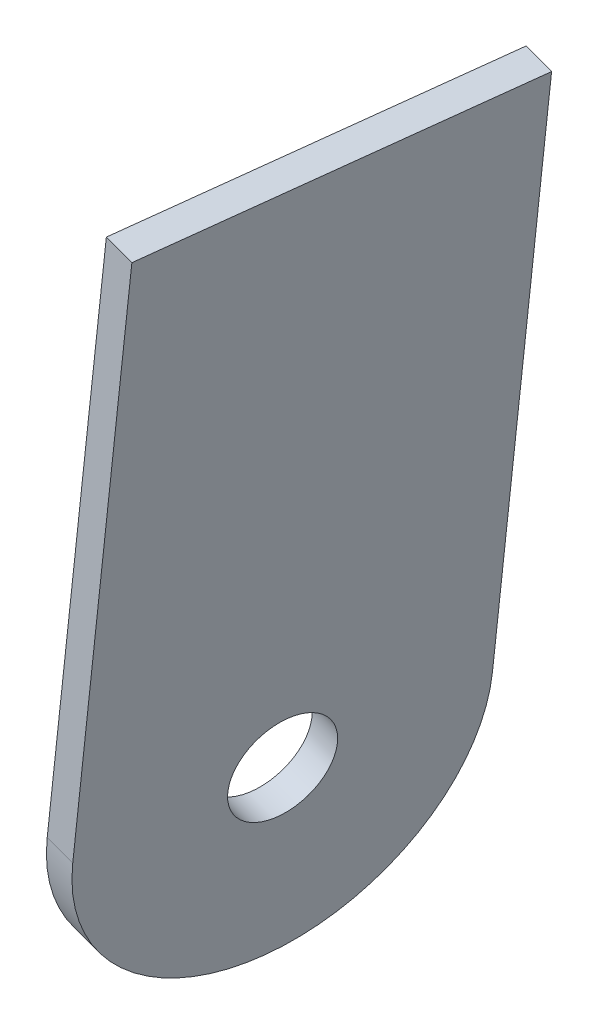
ISO-10303-21;
HEADER;
FILE_DESCRIPTION(('STEP AP214'),'2;1');
FILE_NAME('part.step','',(''),(''),'','','');
FILE_SCHEMA(('AUTOMOTIVE_DESIGN { 1 0 10303 214 1 1 1 1 }'));
ENDSEC;
DATA;
#1=APPLICATION_CONTEXT('core data for automotive mechanical design processes');
#2=APPLICATION_PROTOCOL_DEFINITION('international standard','automotive_design',2000,#1);
#3=PRODUCT_CONTEXT('',#1,'mechanical');
#4=PRODUCT('Part','Part','',(#3));
#5=PRODUCT_RELATED_PRODUCT_CATEGORY('part','',(#4));
#6=PRODUCT_DEFINITION_FORMATION('','',#4);
#7=PRODUCT_DEFINITION_CONTEXT('part definition',#1,'design');
#8=PRODUCT_DEFINITION('design','',#6,#7);
#9=PRODUCT_DEFINITION_SHAPE('','',#8);
#10=(LENGTH_UNIT() NAMED_UNIT(*) SI_UNIT(.MILLI.,.METRE.));
#11=(NAMED_UNIT(*) PLANE_ANGLE_UNIT() SI_UNIT($,.RADIAN.));
#12=(NAMED_UNIT(*) SI_UNIT($,.STERADIAN.) SOLID_ANGLE_UNIT());
#13=UNCERTAINTY_MEASURE_WITH_UNIT(LENGTH_MEASURE(1.E-05),#10,'distance_accuracy_value','');
#14=(GEOMETRIC_REPRESENTATION_CONTEXT(3) GLOBAL_UNCERTAINTY_ASSIGNED_CONTEXT((#13)) GLOBAL_UNIT_ASSIGNED_CONTEXT((#10,
#11,#12)) REPRESENTATION_CONTEXT('',''));
#15=CARTESIAN_POINT('',(0.,0.,0.));
#16=DIRECTION('',(0.,0.,1.));
#17=DIRECTION('',(1.,0.,0.));
#18=AXIS2_PLACEMENT_3D('',#15,#16,#17);
#19=CARTESIAN_POINT('',(-286.846376551254,325.682863199713,-591.634431416079));
#20=DIRECTION('',(-0.976357147680202,0.160922555502941,-0.144328276176855));
#21=DIRECTION('',(-0.162625264388925,-0.986687905764752,0.));
#22=AXIS2_PLACEMENT_3D('',#19,#20,#21);
#23=PLANE('',#22);
#24=DIRECTION('',(0.151111697234675,0.0306780966687194,-0.98804054033407));
#25=VECTOR('',#24,1.);
#26=CARTESIAN_POINT('',(-283.574412970837,355.458873629266,-580.569193857509));
#27=LINE('',#26,#25);
#28=CARTESIAN_POINT('',(-283.574412970837,355.458873629266,-580.569193857509));
#29=VERTEX_POINT('',#28);
#30=CARTESIAN_POINT('',(-280.695735138516,356.043291370805,-599.391366150874));
#31=VERTEX_POINT('',#30);
#32=EDGE_CURVE('E91',#29,#31,#27,.T.);
#33=ORIENTED_EDGE('',*,*,#32,.T.);
#34=DIRECTION('',(-0.154570291882481,-0.986490134525018,-0.0542700594451213));
#35=VECTOR('',#34,1.);
#36=CARTESIAN_POINT('',(-280.695735138516,356.043291370805,-599.391366150874));
#37=LINE('',#36,#35);
#38=CARTESIAN_POINT('',(-285.407037635094,325.975072070483,-601.045517562761));
#39=VERTEX_POINT('',#38);
#40=EDGE_CURVE('E86',#31,#39,#37,.T.);
#41=ORIENTED_EDGE('',*,*,#40,.T.);
#42=CARTESIAN_POINT('',(-286.846376551254,325.682863199713,-591.634431416079));
#43=DIRECTION('',(-0.976357147680202,0.160922555502941,-0.144328276176855));
#44=DIRECTION('',(-0.162625264388925,-0.986687905764752,0.));
#45=AXIS2_PLACEMENT_3D('',#42,#43,#44);
#46=CIRCLE('',#45,9.52500000000011);
#47=CARTESIAN_POINT('',(-288.285715467415,325.390654328943,-582.223345269396));
#48=VERTEX_POINT('',#47);
#49=EDGE_CURVE('E89',#39,#48,#46,.T.);
#50=ORIENTED_EDGE('',*,*,#49,.T.);
#51=DIRECTION('',(0.154570291882482,0.986490134525018,0.0542700594451214));
#52=VECTOR('',#51,1.);
#53=CARTESIAN_POINT('',(-288.285715467415,325.390654328943,-582.223345269397));
#54=LINE('',#53,#52);
#55=EDGE_CURVE('E56',#48,#29,#54,.T.);
#56=ORIENTED_EDGE('',*,*,#55,.T.);
#57=EDGE_LOOP('',(#33,#41,#50,#56));
#58=FACE_BOUND('',#57,.T.);
#59=CARTESIAN_POINT('',(-286.846376551254,325.682863199713,-591.634431416079));
#60=DIRECTION('',(-0.976357147680202,0.160922555502941,-0.144328276176855));
#61=DIRECTION('',(-0.162625264388925,-0.986687905764752,0.));
#62=AXIS2_PLACEMENT_3D('',#59,#60,#61);
#63=CIRCLE('',#62,2.48919999999999);
#64=CARTESIAN_POINT('',(-287.251183359371,323.226799664683,-591.634431416079));
#65=VERTEX_POINT('',#64);
#66=EDGE_CURVE('E106',#65,#65,#63,.T.);
#67=ORIENTED_EDGE('',*,*,#66,.F.);
#68=EDGE_LOOP('',(#67));
#69=FACE_BOUND('',#68,.T.);
#70=ADVANCED_FACE('F39',(#58,#69),#23,.T.);
#71=CARTESIAN_POINT('',(-285.296409579312,325.427398642852,-591.405310277648));
#72=DIRECTION('',(-0.976357147680202,0.160922555502941,-0.144328276176855));
#73=DIRECTION('',(-0.162625264388925,-0.986687905764752,0.));
#74=AXIS2_PLACEMENT_3D('',#71,#72,#73);
#75=PLANE('',#74);
#76=DIRECTION('',(0.151111697234675,0.0306780966687194,-0.98804054033407));
#77=VECTOR('',#76,1.);
#78=CARTESIAN_POINT('',(-282.024445998894,355.203409072405,-580.340072719079));
#79=LINE('',#78,#77);
#80=CARTESIAN_POINT('',(-282.024445998894,355.203409072405,-580.340072719079));
#81=VERTEX_POINT('',#80);
#82=CARTESIAN_POINT('',(-279.145768166574,355.787826813944,-599.162245012443));
#83=VERTEX_POINT('',#82);
#84=EDGE_CURVE('E103',#81,#83,#79,.T.);
#85=ORIENTED_EDGE('',*,*,#84,.F.);
#86=DIRECTION('',(0.154570291882482,0.986490134525018,0.0542700594451214));
#87=VECTOR('',#86,1.);
#88=CARTESIAN_POINT('',(-286.735748495472,325.135189772083,-581.994224130966));
#89=LINE('',#88,#87);
#90=CARTESIAN_POINT('',(-286.735748495472,325.135189772083,-581.994224130966));
#91=VERTEX_POINT('',#90);
#92=EDGE_CURVE('E79',#91,#81,#89,.T.);
#93=ORIENTED_EDGE('',*,*,#92,.F.);
#94=CARTESIAN_POINT('',(-285.296409579312,325.427398642852,-591.405310277648));
#95=DIRECTION('',(-0.976357147680202,0.160922555502941,-0.144328276176855));
#96=DIRECTION('',(-0.162625264388925,-0.986687905764752,0.));
#97=AXIS2_PLACEMENT_3D('',#94,#95,#96);
#98=CIRCLE('',#97,9.52500000000011);
#99=CARTESIAN_POINT('',(-283.857070663152,325.719607513622,-600.81639642433));
#100=VERTEX_POINT('',#99);
#101=EDGE_CURVE('E73',#100,#91,#98,.T.);
#102=ORIENTED_EDGE('',*,*,#101,.F.);
#103=DIRECTION('',(-0.154570291882481,-0.986490134525018,-0.0542700594451213));
#104=VECTOR('',#103,1.);
#105=CARTESIAN_POINT('',(-279.145768166574,355.787826813944,-599.162245012443));
#106=LINE('',#105,#104);
#107=EDGE_CURVE('E95',#83,#100,#106,.T.);
#108=ORIENTED_EDGE('',*,*,#107,.F.);
#109=EDGE_LOOP('',(#85,#93,#102,#108));
#110=FACE_BOUND('',#109,.T.);
#111=CARTESIAN_POINT('',(-285.296409579312,325.427398642852,-591.405310277648));
#112=DIRECTION('',(-0.976357147680202,0.160922555502941,-0.144328276176855));
#113=DIRECTION('',(-0.162625264388925,-0.986687905764752,0.));
#114=AXIS2_PLACEMENT_3D('',#111,#112,#113);
#115=CIRCLE('',#114,2.48919999999999);
#116=CARTESIAN_POINT('',(-285.701216387429,322.971335107822,-591.405310277648));
#117=VERTEX_POINT('',#116);
#118=EDGE_CURVE('E118',#117,#117,#115,.T.);
#119=ORIENTED_EDGE('',*,*,#118,.T.);
#120=EDGE_LOOP('',(#119));
#121=FACE_BOUND('',#120,.T.);
#122=ADVANCED_FACE('F114',(#110,#121),#75,.F.);
#123=CARTESIAN_POINT('',(-283.574412970837,355.458873629266,-580.569193857509));
#124=DIRECTION('',(-0.154570291882482,-0.986490134525018,-0.0542700594451191));
#125=DIRECTION('',(0.987946076170364,-0.154798419176622,0.));
#126=AXIS2_PLACEMENT_3D('',#123,#124,#125);
#127=PLANE('',#126);
#128=ORIENTED_EDGE('',*,*,#84,.T.);
#129=DIRECTION('',(0.976357147680202,-0.160922555502941,0.144328276176856));
#130=VECTOR('',#129,1.);
#131=CARTESIAN_POINT('',(-280.695735138516,356.043291370805,-599.391366150874));
#132=LINE('',#131,#130);
#133=EDGE_CURVE('E11',#31,#83,#132,.T.);
#134=ORIENTED_EDGE('',*,*,#133,.F.);
#135=ORIENTED_EDGE('',*,*,#32,.F.);
#136=DIRECTION('',(0.976357147680202,-0.160922555502941,0.144328276176856));
#137=VECTOR('',#136,1.);
#138=CARTESIAN_POINT('',(-283.574412970837,355.458873629266,-580.569193857509));
#139=LINE('',#138,#137);
#140=EDGE_CURVE('E99',#29,#81,#139,.T.);
#141=ORIENTED_EDGE('',*,*,#140,.T.);
#142=EDGE_LOOP('',(#128,#134,#135,#141));
#143=FACE_BOUND('',#142,.T.);
#144=ADVANCED_FACE('F41',(#143),#127,.F.);
#145=CARTESIAN_POINT('',(-280.695735138516,356.043291370805,-599.391366150874));
#146=DIRECTION('',(-0.151111697234676,-0.0306780966687217,0.98804054033407));
#147=DIRECTION('',(0.988505813788488,0.,0.151182856522686));
#148=AXIS2_PLACEMENT_3D('',#145,#146,#147);
#149=PLANE('',#148);
#150=ORIENTED_EDGE('',*,*,#107,.T.);
#151=DIRECTION('',(0.976357147680202,-0.160922555502941,0.144328276176856));
#152=VECTOR('',#151,1.);
#153=CARTESIAN_POINT('',(-285.407037635094,325.975072070483,-601.045517562761));
#154=LINE('',#153,#152);
#155=EDGE_CURVE('E48',#39,#100,#154,.T.);
#156=ORIENTED_EDGE('',*,*,#155,.F.);
#157=ORIENTED_EDGE('',*,*,#40,.F.);
#158=ORIENTED_EDGE('',*,*,#133,.T.);
#159=EDGE_LOOP('',(#150,#156,#157,#158));
#160=FACE_BOUND('',#159,.T.);
#161=ADVANCED_FACE('F94',(#160),#149,.F.);
#162=CARTESIAN_POINT('',(-286.846376551254,325.682863199713,-591.634431416079));
#163=DIRECTION('',(0.976357147680202,-0.160922555502941,0.144328276176856));
#164=DIRECTION('',(0.162625264388925,0.986687905764752,0.));
#165=AXIS2_PLACEMENT_3D('',#162,#163,#164);
#166=CYLINDRICAL_SURFACE('',#165,9.52500000000011);
#167=ORIENTED_EDGE('',*,*,#101,.T.);
#168=DIRECTION('',(0.976357147680202,-0.160922555502941,0.144328276176856));
#169=VECTOR('',#168,1.);
#170=CARTESIAN_POINT('',(-288.285715467415,325.390654328943,-582.223345269396));
#171=LINE('',#170,#169);
#172=EDGE_CURVE('E96',#48,#91,#171,.T.);
#173=ORIENTED_EDGE('',*,*,#172,.F.);
#174=ORIENTED_EDGE('',*,*,#49,.F.);
#175=ORIENTED_EDGE('',*,*,#155,.T.);
#176=EDGE_LOOP('',(#167,#173,#174,#175));
#177=FACE_BOUND('',#176,.T.);
#178=ADVANCED_FACE('F97',(#177),#166,.T.);
#179=CARTESIAN_POINT('',(-288.285715467415,325.390654328943,-582.223345269397));
#180=DIRECTION('',(0.151111697234676,0.0306780966687217,-0.98804054033407));
#181=DIRECTION('',(-0.988505813788488,0.,-0.151182856522686));
#182=AXIS2_PLACEMENT_3D('',#179,#180,#181);
#183=PLANE('',#182);
#184=ORIENTED_EDGE('',*,*,#92,.T.);
#185=ORIENTED_EDGE('',*,*,#140,.F.);
#186=ORIENTED_EDGE('',*,*,#55,.F.);
#187=ORIENTED_EDGE('',*,*,#172,.T.);
#188=EDGE_LOOP('',(#184,#185,#186,#187));
#189=FACE_BOUND('',#188,.T.);
#190=ADVANCED_FACE('F111',(#189),#183,.F.);
#191=CARTESIAN_POINT('',(-286.846376551254,325.682863199713,-591.634431416079));
#192=DIRECTION('',(0.976357147680202,-0.160922555502941,0.144328276176856));
#193=DIRECTION('',(0.162625264388925,0.986687905764752,0.));
#194=AXIS2_PLACEMENT_3D('',#191,#192,#193);
#195=CYLINDRICAL_SURFACE('',#194,2.48919999999999);
#196=ORIENTED_EDGE('',*,*,#66,.T.);
#197=EDGE_LOOP('',(#196));
#198=FACE_BOUND('',#197,.T.);
#199=ORIENTED_EDGE('',*,*,#118,.F.);
#200=EDGE_LOOP('',(#199));
#201=FACE_BOUND('',#200,.T.);
#202=ADVANCED_FACE('F124',(#198,#201),#195,.F.);
#203=CLOSED_SHELL('',(#70,#122,#144,#161,#178,#190,#202));
#204=MANIFOLD_SOLID_BREP('B2',#203);
#205=ADVANCED_BREP_SHAPE_REPRESENTATION('',(#18,#204),#14);
#206=SHAPE_DEFINITION_REPRESENTATION(#9,#205);
ENDSEC;
END-ISO-10303-21;
